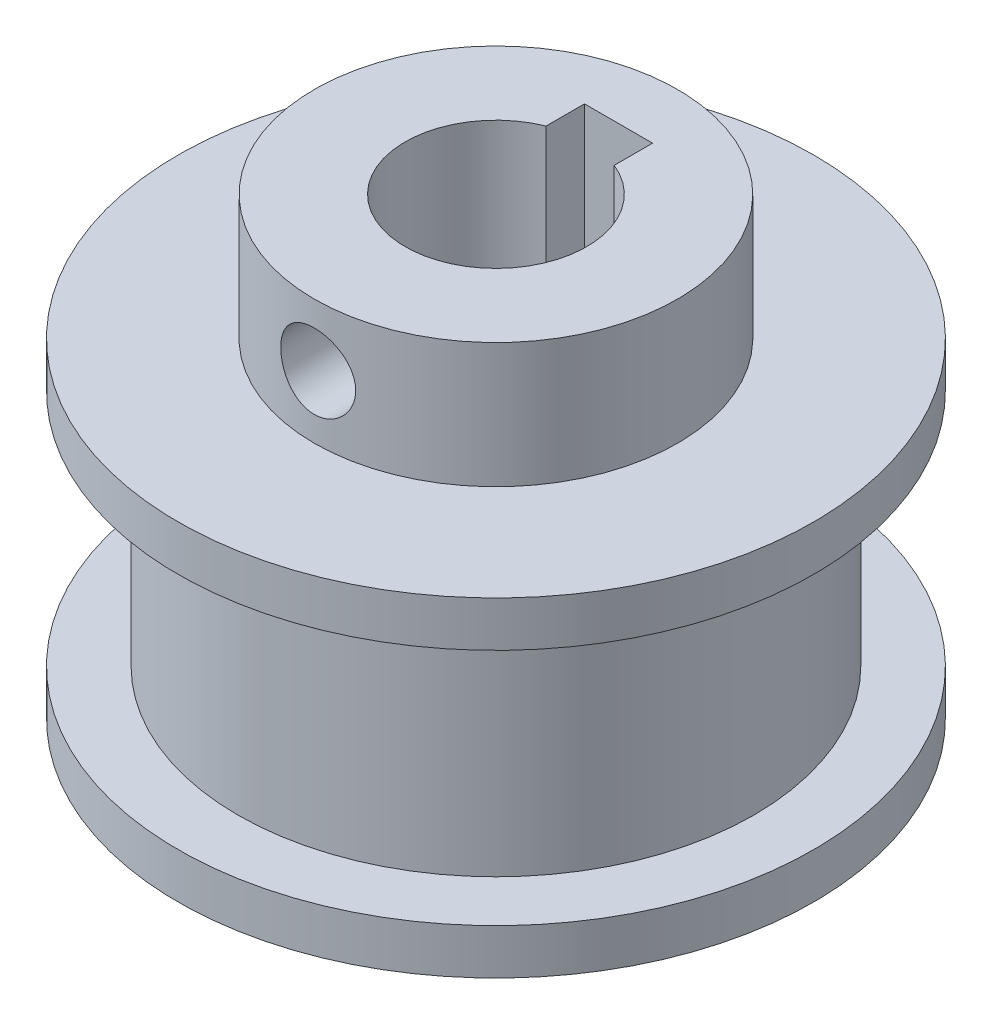
ISO-10303-21;
HEADER;
FILE_DESCRIPTION(('STEP AP214'),'2;1');
FILE_NAME('part.step','',(''),(''),'','','');
FILE_SCHEMA(('AUTOMOTIVE_DESIGN { 1 0 10303 214 1 1 1 1 }'));
ENDSEC;
DATA;
#1=APPLICATION_CONTEXT('core data for automotive mechanical design processes');
#2=APPLICATION_PROTOCOL_DEFINITION('international standard','automotive_design',2000,#1);
#3=PRODUCT_CONTEXT('',#1,'mechanical');
#4=PRODUCT('Part','Part','',(#3));
#5=PRODUCT_RELATED_PRODUCT_CATEGORY('part','',(#4));
#6=PRODUCT_DEFINITION_FORMATION('','',#4);
#7=PRODUCT_DEFINITION_CONTEXT('part definition',#1,'design');
#8=PRODUCT_DEFINITION('design','',#6,#7);
#9=PRODUCT_DEFINITION_SHAPE('','',#8);
#10=(LENGTH_UNIT() NAMED_UNIT(*) SI_UNIT(.MILLI.,.METRE.));
#11=(NAMED_UNIT(*) PLANE_ANGLE_UNIT() SI_UNIT($,.RADIAN.));
#12=(NAMED_UNIT(*) SI_UNIT($,.STERADIAN.) SOLID_ANGLE_UNIT());
#13=UNCERTAINTY_MEASURE_WITH_UNIT(LENGTH_MEASURE(1.E-05),#10,'distance_accuracy_value','');
#14=(GEOMETRIC_REPRESENTATION_CONTEXT(3) GLOBAL_UNCERTAINTY_ASSIGNED_CONTEXT((#13)) GLOBAL_UNIT_ASSIGNED_CONTEXT((#10,
#11,#12)) REPRESENTATION_CONTEXT('',''));
#15=CARTESIAN_POINT('',(0.,0.,0.));
#16=DIRECTION('',(0.,0.,1.));
#17=DIRECTION('',(1.,0.,0.));
#18=AXIS2_PLACEMENT_3D('',#15,#16,#17);
#19=CARTESIAN_POINT('',(0.,14.5,0.));
#20=DIRECTION('',(0.,-1.,0.));
#21=DIRECTION('',(0.,0.,-1.));
#22=AXIS2_PLACEMENT_3D('',#19,#20,#21);
#23=CYLINDRICAL_SURFACE('',#22,14.);
#24=CARTESIAN_POINT('',(0.,12.5,0.));
#25=DIRECTION('',(0.,1.,0.));
#26=DIRECTION('',(0.,0.,1.));
#27=AXIS2_PLACEMENT_3D('',#24,#25,#26);
#28=CIRCLE('',#27,14.);
#29=CARTESIAN_POINT('',(0.,12.5,-14.));
#30=VERTEX_POINT('',#29);
#31=EDGE_CURVE('E141',#30,#30,#28,.T.);
#32=CARTESIAN_POINT('',(0.,14.5,0.));
#33=DIRECTION('',(0.,1.,0.));
#34=DIRECTION('',(0.,0.,1.));
#35=AXIS2_PLACEMENT_3D('',#32,#33,#34);
#36=CIRCLE('',#35,14.);
#37=CARTESIAN_POINT('',(0.,14.5,-14.));
#38=VERTEX_POINT('',#37);
#39=EDGE_CURVE('E142',#38,#38,#36,.T.);
#40=CARTESIAN_POINT('',(0.,12.5,-14.));
#41=CARTESIAN_POINT('',(0.,12.5208333333333,-14.));
#42=CARTESIAN_POINT('',(0.,12.5416666666667,-14.));
#43=CARTESIAN_POINT('',(0.,12.5833333333333,-14.));
#44=CARTESIAN_POINT('',(0.,12.6041666666667,-14.));
#45=CARTESIAN_POINT('',(0.,12.6458333333333,-14.));
#46=CARTESIAN_POINT('',(0.,12.6666666666667,-14.));
#47=CARTESIAN_POINT('',(0.,12.7083333333333,-14.));
#48=CARTESIAN_POINT('',(0.,12.7291666666667,-14.));
#49=CARTESIAN_POINT('',(0.,12.7708333333333,-14.));
#50=CARTESIAN_POINT('',(0.,12.7916666666667,-14.));
#51=CARTESIAN_POINT('',(0.,12.8333333333333,-14.));
#52=CARTESIAN_POINT('',(0.,12.8541666666667,-14.));
#53=CARTESIAN_POINT('',(0.,12.8958333333333,-14.));
#54=CARTESIAN_POINT('',(0.,12.9166666666667,-14.));
#55=CARTESIAN_POINT('',(0.,12.9583333333333,-14.));
#56=CARTESIAN_POINT('',(0.,12.9791666666667,-14.));
#57=CARTESIAN_POINT('',(0.,13.0208333333333,-14.));
#58=CARTESIAN_POINT('',(0.,13.0416666666667,-14.));
#59=CARTESIAN_POINT('',(0.,13.0833333333333,-14.));
#60=CARTESIAN_POINT('',(0.,13.1041666666667,-14.));
#61=CARTESIAN_POINT('',(0.,13.1458333333333,-14.));
#62=CARTESIAN_POINT('',(0.,13.1666666666667,-14.));
#63=CARTESIAN_POINT('',(0.,13.2083333333333,-14.));
#64=CARTESIAN_POINT('',(0.,13.2291666666667,-14.));
#65=CARTESIAN_POINT('',(0.,13.2708333333333,-14.));
#66=CARTESIAN_POINT('',(0.,13.2916666666667,-14.));
#67=CARTESIAN_POINT('',(0.,13.3333333333333,-14.));
#68=CARTESIAN_POINT('',(0.,13.3541666666667,-14.));
#69=CARTESIAN_POINT('',(0.,13.3958333333333,-14.));
#70=CARTESIAN_POINT('',(0.,13.4166666666667,-14.));
#71=CARTESIAN_POINT('',(0.,13.4583333333333,-14.));
#72=CARTESIAN_POINT('',(0.,13.4791666666667,-14.));
#73=CARTESIAN_POINT('',(0.,13.5208333333333,-14.));
#74=CARTESIAN_POINT('',(0.,13.5416666666667,-14.));
#75=CARTESIAN_POINT('',(0.,13.5833333333333,-14.));
#76=CARTESIAN_POINT('',(0.,13.6041666666667,-14.));
#77=CARTESIAN_POINT('',(0.,13.6458333333333,-14.));
#78=CARTESIAN_POINT('',(0.,13.6666666666667,-14.));
#79=CARTESIAN_POINT('',(0.,13.7083333333333,-14.));
#80=CARTESIAN_POINT('',(0.,13.7291666666667,-14.));
#81=CARTESIAN_POINT('',(0.,13.7708333333333,-14.));
#82=CARTESIAN_POINT('',(0.,13.7916666666667,-14.));
#83=CARTESIAN_POINT('',(0.,13.8333333333333,-14.));
#84=CARTESIAN_POINT('',(0.,13.8541666666667,-14.));
#85=CARTESIAN_POINT('',(0.,13.8958333333333,-14.));
#86=CARTESIAN_POINT('',(0.,13.9166666666667,-14.));
#87=CARTESIAN_POINT('',(0.,13.9583333333333,-14.));
#88=CARTESIAN_POINT('',(0.,13.9791666666667,-14.));
#89=CARTESIAN_POINT('',(0.,14.0208333333333,-14.));
#90=CARTESIAN_POINT('',(0.,14.0416666666667,-14.));
#91=CARTESIAN_POINT('',(0.,14.0833333333333,-14.));
#92=CARTESIAN_POINT('',(0.,14.1041666666667,-14.));
#93=CARTESIAN_POINT('',(0.,14.1458333333333,-14.));
#94=CARTESIAN_POINT('',(0.,14.1666666666667,-14.));
#95=CARTESIAN_POINT('',(0.,14.2083333333333,-14.));
#96=CARTESIAN_POINT('',(0.,14.2291666666667,-14.));
#97=CARTESIAN_POINT('',(0.,14.2708333333333,-14.));
#98=CARTESIAN_POINT('',(0.,14.2916666666667,-14.));
#99=CARTESIAN_POINT('',(0.,14.3333333333333,-14.));
#100=CARTESIAN_POINT('',(0.,14.3541666666667,-14.));
#101=CARTESIAN_POINT('',(0.,14.3958333333333,-14.));
#102=CARTESIAN_POINT('',(0.,14.4166666666667,-14.));
#103=CARTESIAN_POINT('',(0.,14.4583333333333,-14.));
#104=CARTESIAN_POINT('',(0.,14.4791666666667,-14.));
#105=CARTESIAN_POINT('',(0.,14.5,-14.));
#106=B_SPLINE_CURVE_WITH_KNOTS('',3,(#40,#41,#42,#43,#44,#45,#46,#47,#48,#49,#50,#51,#52,#53,
#54,#55,#56,#57,#58,#59,#60,#61,#62,#63,#64,#65,#66,#67,#68,#69,#70,#71,#72,#73,#74,#75,#76,#77,
#78,#79,#80,#81,#82,#83,#84,#85,#86,#87,#88,#89,#90,#91,#92,#93,#94,#95,#96,#97,#98,#99,#100,
#101,#102,#103,#104,#105),.UNSPECIFIED.,.F.,.F.,(4,2,2,2,2,2,2,2,2,2,2,2,2,2,2,2,2,2,2,2,2,2,2,
2,2,2,2,2,2,2,2,2,4),(0.,0.0625000000000001,0.124999999999998,0.187499999999998,
0.249999999999999,0.312499999999999,0.374999999999999,0.437499999999999,0.499999999999999,
0.562499999999999,0.624999999999999,0.687499999999999,0.749999999999999,0.812499999999999,
0.874999999999999,0.937499999999999,0.999999999999999,1.0625,1.125,1.1875,1.25,1.3125,1.375,
1.4375,1.5,1.5625,1.625,1.6875,1.75,1.8125,1.875,1.9375,2.),.UNSPECIFIED.);
#107=EDGE_CURVE('BSEAM41',#30,#38,#106,.T.);
#108=ORIENTED_EDGE('',*,*,#31,.T.);
#109=ORIENTED_EDGE('',*,*,#39,.F.);
#110=ORIENTED_EDGE('',*,*,#107,.T.);
#111=ORIENTED_EDGE('',*,*,#107,.F.);
#112=EDGE_LOOP('',(#108,#110,#109,#111));
#113=FACE_BOUND('',#112,.T.);
#114=ADVANCED_FACE('F41',(#113),#23,.T.);
#115=CARTESIAN_POINT('',(0.,14.5,0.));
#116=DIRECTION('',(0.,1.,0.));
#117=DIRECTION('',(0.,0.,1.));
#118=AXIS2_PLACEMENT_3D('',#115,#116,#117);
#119=PLANE('',#118);
#120=ORIENTED_EDGE('',*,*,#39,.T.);
#121=EDGE_LOOP('',(#120));
#122=FACE_BOUND('',#121,.T.);
#123=CARTESIAN_POINT('',(0.,14.5,0.));
#124=DIRECTION('',(0.,1.,0.));
#125=DIRECTION('',(0.,0.,1.));
#126=AXIS2_PLACEMENT_3D('',#123,#124,#125);
#127=CIRCLE('',#126,8.);
#128=CARTESIAN_POINT('',(0.,14.5,8.));
#129=VERTEX_POINT('',#128);
#130=EDGE_CURVE('E138',#129,#129,#127,.T.);
#131=ORIENTED_EDGE('',*,*,#130,.F.);
#132=EDGE_LOOP('',(#131));
#133=FACE_BOUND('',#132,.T.);
#134=ADVANCED_FACE('F165',(#122,#133),#119,.T.);
#135=CARTESIAN_POINT('',(0.,20.,0.));
#136=DIRECTION('',(0.,-1.,0.));
#137=DIRECTION('',(0.,0.,-1.));
#138=AXIS2_PLACEMENT_3D('',#135,#136,#137);
#139=CYLINDRICAL_SURFACE('',#138,8.);
#140=CARTESIAN_POINT('',(1.65,17.25,7.82799463464303));
#141=CARTESIAN_POINT('',(1.64999668532493,17.1583826502059,7.82799647234761));
#142=CARTESIAN_POINT('',(1.64234339972764,17.0667241852472,7.82962054015776));
#143=CARTESIAN_POINT('',(1.61196056082936,16.8860046309142,7.83593102109728));
#144=CARTESIAN_POINT('',(1.58921932254548,16.7969456105535,7.84061980768031));
#145=CARTESIAN_POINT('',(1.52939944297714,16.6240655077954,7.85250661788931));
#146=CARTESIAN_POINT('',(1.49233553761892,16.5402391443872,7.85970206178507));
#147=CARTESIAN_POINT('',(1.40496339378157,16.3799953977351,7.8757883628587));
#148=CARTESIAN_POINT('',(1.35465574212316,16.3035776864245,7.88467914491256));
#149=CARTESIAN_POINT('',(1.24141806188276,16.1591686968544,7.90330366333984));
#150=CARTESIAN_POINT('',(1.17832691131059,16.0913049987195,7.91304715328143));
#151=CARTESIAN_POINT('',(1.04166118718968,15.9670453862397,7.93219354684102));
#152=CARTESIAN_POINT('',(0.968085854144703,15.9106503034243,7.9415964257225));
#153=CARTESIAN_POINT('',(0.811692001393456,15.8104305736417,7.95910768239297));
#154=CARTESIAN_POINT('',(0.728793920101066,15.7667276461819,7.9672032148807));
#155=CARTESIAN_POINT('',(0.556636173632881,15.6939188905658,7.98107786735649));
#156=CARTESIAN_POINT('',(0.467377143134518,15.6648116084199,7.9868572180665));
#157=CARTESIAN_POINT('',(0.286356118265321,15.622418887495,7.99537941797959));
#158=CARTESIAN_POINT('',(0.19464659352139,15.6089178479032,7.99816360714569));
#159=CARTESIAN_POINT('',(0.0102247919218258,15.5974477285783,8.00052470522147));
#160=CARTESIAN_POINT('',(-0.082487381468869,15.5994770612279,8.00010194196704));
#161=CARTESIAN_POINT('',(-0.264799667160886,15.6188475119041,7.9961286601365));
#162=CARTESIAN_POINT('',(-0.354425644609062,15.6359563448791,7.99262559257093));
#163=CARTESIAN_POINT('',(-0.529506535845927,15.6846311464242,7.98293899531616));
#164=CARTESIAN_POINT('',(-0.614961275239553,15.7161977188853,7.97675535366161));
#165=CARTESIAN_POINT('',(-0.779930808135336,15.7931039596909,7.96232481023258));
#166=CARTESIAN_POINT('',(-0.859402403191202,15.838533669891,7.95406448397429));
#167=CARTESIAN_POINT('',(-1.00967984091355,15.9418098140578,7.93638961806161));
#168=CARTESIAN_POINT('',(-1.0804846248177,15.9996577626995,7.92697493766869));
#169=CARTESIAN_POINT('',(-1.21279807501825,16.1273994926951,7.9078239642189));
#170=CARTESIAN_POINT('',(-1.27411022634264,16.1974965760101,7.89808494418976));
#171=CARTESIAN_POINT('',(-1.38414252261934,16.3470770452591,7.87954771497238));
#172=CARTESIAN_POINT('',(-1.43286239817598,16.4265606319523,7.87074952591436));
#173=CARTESIAN_POINT('',(-1.51640121308694,16.592951545323,7.85508413098618));
#174=CARTESIAN_POINT('',(-1.55118662114807,16.6798761755531,7.84822159457677));
#175=CARTESIAN_POINT('',(-1.60559987539904,16.8585111082259,7.83727167258975));
#176=CARTESIAN_POINT('',(-1.62522983445703,16.9502207416726,7.83318390018328));
#177=CARTESIAN_POINT('',(-1.64847767759948,17.1340365645272,7.82832430034404));
#178=CARTESIAN_POINT('',(-1.65238010858406,17.2261052491494,7.82749355348184));
#179=CARTESIAN_POINT('',(-1.64482933127386,17.409577873694,7.8290836566982));
#180=CARTESIAN_POINT('',(-1.63337705280605,17.5009818535317,7.83150430988348));
#181=CARTESIAN_POINT('',(-1.59568777426686,17.6795629257063,7.83926913983493));
#182=CARTESIAN_POINT('',(-1.56960432546509,17.7667738663095,7.84458293687796));
#183=CARTESIAN_POINT('',(-1.50355797289372,17.9355877632628,7.85750843647708));
#184=CARTESIAN_POINT('',(-1.46359386451765,18.0171902321559,7.8651203384623));
#185=CARTESIAN_POINT('',(-1.37028211396986,18.1737114518423,7.88191579950281));
#186=CARTESIAN_POINT('',(-1.31675731908659,18.2485223754957,7.89111960565472));
#187=CARTESIAN_POINT('',(-1.19807829347333,18.3882045238013,7.91000699478186));
#188=CARTESIAN_POINT('',(-1.1329227860428,18.453074655801,7.91969063034348));
#189=CARTESIAN_POINT('',(-0.991551131023632,18.5721209376943,7.93863877717957));
#190=CARTESIAN_POINT('',(-0.915171051258589,18.6261041698581,7.94789380519354));
#191=CARTESIAN_POINT('',(-0.754260738130267,18.7204722827775,7.96477402593325));
#192=CARTESIAN_POINT('',(-0.669730860728579,18.7608577571013,7.97239928979603));
#193=CARTESIAN_POINT('',(-0.495414150876533,18.8266068059184,7.98512048804082));
#194=CARTESIAN_POINT('',(-0.405661891513268,18.852059030768,7.99023131933467));
#195=CARTESIAN_POINT('',(-0.223039444294584,18.8874987524781,7.99741186635557));
#196=CARTESIAN_POINT('',(-0.13016965858092,18.8974882361651,7.99948197278732));
#197=CARTESIAN_POINT('',(0.0542126492055752,18.9016379277564,8.00033781964049));
#198=CARTESIAN_POINT('',(0.1457185021403,18.8960875124828,7.99918360281958));
#199=CARTESIAN_POINT('',(0.326463478938169,18.8699566049096,7.99384751004402));
#200=CARTESIAN_POINT('',(0.415702635080899,18.8493763267716,7.98966567723011));
#201=CARTESIAN_POINT('',(0.589186560182798,18.7939018588418,7.97874682116246));
#202=CARTESIAN_POINT('',(0.673443542985808,18.759044489013,7.97201637401338));
#203=CARTESIAN_POINT('',(0.834953513276953,18.6760429578936,7.95672300876336));
#204=CARTESIAN_POINT('',(0.912205904261781,18.6278976664275,7.9481599348062));
#205=CARTESIAN_POINT('',(1.05893847166514,18.5187213547144,7.92995681960445));
#206=CARTESIAN_POINT('',(1.12826349060999,18.45748443025,7.92030089151862));
#207=CARTESIAN_POINT('',(1.25575285452553,18.3242837583535,7.90109178015231));
#208=CARTESIAN_POINT('',(1.31391453937944,18.2523174614546,7.89153862187156));
#209=CARTESIAN_POINT('',(1.41807001635074,18.0986988961721,7.87349423401939));
#210=CARTESIAN_POINT('',(1.46391490783104,18.0169439976916,7.86501660134749));
#211=CARTESIAN_POINT('',(1.54114313624576,17.8467371138309,7.85025069483304));
#212=CARTESIAN_POINT('',(1.5725393093673,17.7582911544332,7.84396047891661));
#213=CARTESIAN_POINT('',(1.61404620798978,17.5997327756977,7.83550744278865));
#214=CARTESIAN_POINT('',(1.62750420424828,17.530511051599,7.83270799535493));
#215=CARTESIAN_POINT('',(1.64548220150439,17.3908676234553,7.82895092043294));
#216=CARTESIAN_POINT('',(1.65000254870379,17.3204459659967,7.82799322160417));
#217=CARTESIAN_POINT('',(1.65,17.25,7.82799463464303));
#218=B_SPLINE_CURVE_WITH_KNOTS('',3,(#140,#141,#142,#143,#144,#145,#146,#147,#148,#149,#150,
#151,#152,#153,#154,#155,#156,#157,#158,#159,#160,#161,#162,#163,#164,#165,#166,#167,#168,#169,
#170,#171,#172,#173,#174,#175,#176,#177,#178,#179,#180,#181,#182,#183,#184,#185,#186,#187,#188,
#189,#190,#191,#192,#193,#194,#195,#196,#197,#198,#199,#200,#201,#202,#203,#204,#205,#206,#207,
#208,#209,#210,#211,#212,#213,#214,#215,#216,#217),.UNSPECIFIED.,.T.,.F.,(4,2,2,2,2,2,2,2,2,2,2,
2,2,2,2,2,2,2,2,2,2,2,2,2,2,2,2,2,2,2,2,2,2,2,2,2,2,2,4),(0.,0.274594036981752,
0.549400984088788,0.823925944657623,1.09843874327276,1.3766547467594,1.65489091505465,
1.93571338943598,2.21650788327397,2.49337499570618,2.7702138053317,3.04286128513494,
3.31552015429504,3.58998907522696,3.86449149267073,4.14407920367274,4.42367289560191,
4.70393540521659,4.98415883550652,5.25928898855095,5.53440248143718,5.80668132243983,
6.0789837985472,6.35504561674321,6.63113775683412,6.91175972338567,7.19236943866023,
7.47129602001297,7.75018675877318,8.02391884651825,8.29764703391016,8.57067368982023,
8.84372357458462,9.12143378060414,9.39921008040031,9.68020708192083,9.96095396255222,
10.1721016499173,10.38324115827),.UNSPECIFIED.);
#219=CARTESIAN_POINT('',(1.65,17.25,7.82799463464303));
#220=VERTEX_POINT('',#219);
#221=EDGE_CURVE('E11',#220,#220,#218,.T.);
#222=ORIENTED_EDGE('',*,*,#221,.T.);
#223=EDGE_LOOP('',(#222));
#224=FACE_BOUND('',#223,.T.);
#225=CARTESIAN_POINT('',(0.,20.,0.));
#226=DIRECTION('',(0.,1.,0.));
#227=DIRECTION('',(0.,0.,1.));
#228=AXIS2_PLACEMENT_3D('',#225,#226,#227);
#229=CIRCLE('',#228,8.);
#230=CARTESIAN_POINT('',(0.,20.,8.));
#231=VERTEX_POINT('',#230);
#232=EDGE_CURVE('E134',#231,#231,#229,.T.);
#233=ORIENTED_EDGE('',*,*,#232,.F.);
#234=EDGE_LOOP('',(#233));
#235=FACE_BOUND('',#234,.T.);
#236=ORIENTED_EDGE('',*,*,#130,.T.);
#237=EDGE_LOOP('',(#236));
#238=FACE_BOUND('',#237,.T.);
#239=ADVANCED_FACE('F159',(#224,#235,#238),#139,.T.);
#240=CARTESIAN_POINT('',(0.,20.,0.));
#241=DIRECTION('',(0.,1.,0.));
#242=DIRECTION('',(0.,0.,1.));
#243=AXIS2_PLACEMENT_3D('',#240,#241,#242);
#244=PLANE('',#243);
#245=DIRECTION('',(0.,0.,-1.));
#246=VECTOR('',#245,1.);
#247=CARTESIAN_POINT('',(1.5,20.,-5.4));
#248=LINE('',#247,#246);
#249=CARTESIAN_POINT('',(1.5,20.,-3.70809924354783));
#250=VERTEX_POINT('',#249);
#251=CARTESIAN_POINT('',(1.5,20.,-5.4));
#252=VERTEX_POINT('',#251);
#253=EDGE_CURVE('E92',#250,#252,#248,.T.);
#254=ORIENTED_EDGE('',*,*,#253,.F.);
#255=CARTESIAN_POINT('',(0.,20.,0.));
#256=DIRECTION('',(0.,1.,0.));
#257=DIRECTION('',(0.,0.,1.));
#258=AXIS2_PLACEMENT_3D('',#255,#256,#257);
#259=CIRCLE('',#258,4.);
#260=CARTESIAN_POINT('',(-1.5,20.,-3.70809924354783));
#261=VERTEX_POINT('',#260);
#262=EDGE_CURVE('E122',#261,#250,#259,.T.);
#263=ORIENTED_EDGE('',*,*,#262,.F.);
#264=DIRECTION('',(0.,0.,1.));
#265=VECTOR('',#264,1.);
#266=CARTESIAN_POINT('',(-1.5,20.,-5.4));
#267=LINE('',#266,#265);
#268=CARTESIAN_POINT('',(-1.5,20.,-5.4));
#269=VERTEX_POINT('',#268);
#270=EDGE_CURVE('E61',#269,#261,#267,.T.);
#271=ORIENTED_EDGE('',*,*,#270,.F.);
#272=DIRECTION('',(-1.,0.,0.));
#273=VECTOR('',#272,1.);
#274=CARTESIAN_POINT('',(-1.5,20.,-5.4));
#275=LINE('',#274,#273);
#276=EDGE_CURVE('E110',#252,#269,#275,.T.);
#277=ORIENTED_EDGE('',*,*,#276,.F.);
#278=EDGE_LOOP('',(#254,#263,#271,#277));
#279=FACE_BOUND('',#278,.T.);
#280=ORIENTED_EDGE('',*,*,#232,.T.);
#281=EDGE_LOOP('',(#280));
#282=FACE_BOUND('',#281,.T.);
#283=ADVANCED_FACE('F155',(#279,#282),#244,.T.);
#284=CARTESIAN_POINT('',(0.,12.5,16.635));
#285=DIRECTION('',(0.,1.,0.));
#286=DIRECTION('',(0.,0.,1.));
#287=AXIS2_PLACEMENT_3D('',#284,#285,#286);
#288=PLANE('',#287);
#289=CARTESIAN_POINT('',(0.,12.5,0.));
#290=DIRECTION('',(0.,1.,0.));
#291=DIRECTION('',(0.,0.,1.));
#292=AXIS2_PLACEMENT_3D('',#289,#290,#291);
#293=CIRCLE('',#292,11.365);
#294=CARTESIAN_POINT('',(0.,12.5,11.365));
#295=VERTEX_POINT('',#294);
#296=EDGE_CURVE('E130',#295,#295,#293,.T.);
#297=ORIENTED_EDGE('',*,*,#296,.T.);
#298=EDGE_LOOP('',(#297));
#299=FACE_BOUND('',#298,.T.);
#300=ORIENTED_EDGE('',*,*,#31,.F.);
#301=EDGE_LOOP('',(#300));
#302=FACE_BOUND('',#301,.T.);
#303=ADVANCED_FACE('F158',(#299,#302),#288,.F.);
#304=CARTESIAN_POINT('',(0.,2.,16.635));
#305=DIRECTION('',(0.,-1.,0.));
#306=DIRECTION('',(0.,0.,-1.));
#307=AXIS2_PLACEMENT_3D('',#304,#305,#306);
#308=PLANE('',#307);
#309=CARTESIAN_POINT('',(0.,2.,0.));
#310=DIRECTION('',(0.,1.,0.));
#311=DIRECTION('',(0.,0.,1.));
#312=AXIS2_PLACEMENT_3D('',#309,#310,#311);
#313=CIRCLE('',#312,11.365);
#314=CARTESIAN_POINT('',(0.,2.,11.365));
#315=VERTEX_POINT('',#314);
#316=EDGE_CURVE('E125',#315,#315,#313,.T.);
#317=ORIENTED_EDGE('',*,*,#316,.F.);
#318=EDGE_LOOP('',(#317));
#319=FACE_BOUND('',#318,.T.);
#320=CARTESIAN_POINT('',(0.,2.,0.));
#321=DIRECTION('',(0.,-1.,0.));
#322=DIRECTION('',(0.,0.,-1.));
#323=AXIS2_PLACEMENT_3D('',#320,#321,#322);
#324=CIRCLE('',#323,14.);
#325=CARTESIAN_POINT('',(0.,2.00000000000001,-14.));
#326=VERTEX_POINT('',#325);
#327=EDGE_CURVE('E133',#326,#326,#324,.T.);
#328=ORIENTED_EDGE('',*,*,#327,.F.);
#329=EDGE_LOOP('',(#328));
#330=FACE_BOUND('',#329,.T.);
#331=ADVANCED_FACE('F185',(#319,#330),#308,.F.);
#332=CARTESIAN_POINT('',(0.,14.5,0.));
#333=DIRECTION('',(0.,1.,0.));
#334=DIRECTION('',(0.,0.,1.));
#335=AXIS2_PLACEMENT_3D('',#332,#333,#334);
#336=CYLINDRICAL_SURFACE('',#335,11.365);
#337=ORIENTED_EDGE('',*,*,#296,.F.);
#338=EDGE_LOOP('',(#337));
#339=FACE_BOUND('',#338,.T.);
#340=ORIENTED_EDGE('',*,*,#316,.T.);
#341=EDGE_LOOP('',(#340));
#342=FACE_BOUND('',#341,.T.);
#343=ADVANCED_FACE('F178',(#339,#342),#336,.T.);
#344=CARTESIAN_POINT('',(0.,0.,0.));
#345=DIRECTION('',(0.,1.,0.));
#346=DIRECTION('',(0.,0.,1.));
#347=AXIS2_PLACEMENT_3D('',#344,#345,#346);
#348=PLANE('',#347);
#349=CARTESIAN_POINT('',(0.,0.,0.));
#350=DIRECTION('',(0.,1.,0.));
#351=DIRECTION('',(0.,0.,1.));
#352=AXIS2_PLACEMENT_3D('',#349,#350,#351);
#353=CIRCLE('',#352,4.);
#354=CARTESIAN_POINT('',(-1.5,0.,-3.70809924354783));
#355=VERTEX_POINT('',#354);
#356=CARTESIAN_POINT('',(1.5,0.,-3.70809924354783));
#357=VERTEX_POINT('',#356);
#358=EDGE_CURVE('E108',#355,#357,#353,.T.);
#359=ORIENTED_EDGE('',*,*,#358,.T.);
#360=DIRECTION('',(0.,0.,-1.));
#361=VECTOR('',#360,1.);
#362=CARTESIAN_POINT('',(1.5,0.,-5.4));
#363=LINE('',#362,#361);
#364=CARTESIAN_POINT('',(1.5,0.,-5.4));
#365=VERTEX_POINT('',#364);
#366=EDGE_CURVE('E89',#357,#365,#363,.T.);
#367=ORIENTED_EDGE('',*,*,#366,.T.);
#368=DIRECTION('',(-1.,0.,0.));
#369=VECTOR('',#368,1.);
#370=CARTESIAN_POINT('',(-1.5,0.,-5.4));
#371=LINE('',#370,#369);
#372=CARTESIAN_POINT('',(-1.5,0.,-5.4));
#373=VERTEX_POINT('',#372);
#374=EDGE_CURVE('E100',#365,#373,#371,.T.);
#375=ORIENTED_EDGE('',*,*,#374,.T.);
#376=DIRECTION('',(0.,0.,1.));
#377=VECTOR('',#376,1.);
#378=CARTESIAN_POINT('',(-1.5,0.,-5.4));
#379=LINE('',#378,#377);
#380=EDGE_CURVE('E97',#373,#355,#379,.T.);
#381=ORIENTED_EDGE('',*,*,#380,.T.);
#382=EDGE_LOOP('',(#359,#367,#375,#381));
#383=FACE_BOUND('',#382,.T.);
#384=CARTESIAN_POINT('',(0.,0.,0.));
#385=DIRECTION('',(0.,1.,0.));
#386=DIRECTION('',(0.,0.,1.));
#387=AXIS2_PLACEMENT_3D('',#384,#385,#386);
#388=CIRCLE('',#387,14.);
#389=CARTESIAN_POINT('',(0.,0.,-14.));
#390=VERTEX_POINT('',#389);
#391=EDGE_CURVE('E137',#390,#390,#388,.T.);
#392=ORIENTED_EDGE('',*,*,#391,.F.);
#393=EDGE_LOOP('',(#392));
#394=FACE_BOUND('',#393,.T.);
#395=ADVANCED_FACE('F105',(#383,#394),#348,.F.);
#396=CARTESIAN_POINT('',(0.,2.00000000000001,-14.));
#397=CARTESIAN_POINT('',(0.,1.97916666666667,-14.));
#398=CARTESIAN_POINT('',(0.,1.95833333333334,-14.));
#399=CARTESIAN_POINT('',(0.,1.91666666666667,-14.));
#400=CARTESIAN_POINT('',(0.,1.89583333333334,-14.));
#401=CARTESIAN_POINT('',(0.,1.85416666666667,-14.));
#402=CARTESIAN_POINT('',(0.,1.83333333333334,-14.));
#403=CARTESIAN_POINT('',(0.,1.79166666666667,-14.));
#404=CARTESIAN_POINT('',(0.,1.77083333333334,-14.));
#405=CARTESIAN_POINT('',(0.,1.72916666666667,-14.));
#406=CARTESIAN_POINT('',(0.,1.70833333333334,-14.));
#407=CARTESIAN_POINT('',(0.,1.66666666666667,-14.));
#408=CARTESIAN_POINT('',(0.,1.64583333333334,-14.));
#409=CARTESIAN_POINT('',(0.,1.60416666666667,-14.));
#410=CARTESIAN_POINT('',(0.,1.58333333333334,-14.));
#411=CARTESIAN_POINT('',(0.,1.54166666666667,-14.));
#412=CARTESIAN_POINT('',(0.,1.52083333333334,-14.));
#413=CARTESIAN_POINT('',(0.,1.47916666666667,-14.));
#414=CARTESIAN_POINT('',(0.,1.45833333333334,-14.));
#415=CARTESIAN_POINT('',(0.,1.41666666666667,-14.));
#416=CARTESIAN_POINT('',(0.,1.39583333333334,-14.));
#417=CARTESIAN_POINT('',(0.,1.35416666666667,-14.));
#418=CARTESIAN_POINT('',(0.,1.33333333333334,-14.));
#419=CARTESIAN_POINT('',(0.,1.29166666666667,-14.));
#420=CARTESIAN_POINT('',(0.,1.27083333333334,-14.));
#421=CARTESIAN_POINT('',(0.,1.22916666666667,-14.));
#422=CARTESIAN_POINT('',(0.,1.20833333333334,-14.));
#423=CARTESIAN_POINT('',(0.,1.16666666666667,-14.));
#424=CARTESIAN_POINT('',(0.,1.14583333333334,-14.));
#425=CARTESIAN_POINT('',(0.,1.10416666666667,-14.));
#426=CARTESIAN_POINT('',(0.,1.08333333333334,-14.));
#427=CARTESIAN_POINT('',(0.,1.04166666666667,-14.));
#428=CARTESIAN_POINT('',(0.,1.02083333333334,-14.));
#429=CARTESIAN_POINT('',(0.,0.979166666666669,-14.));
#430=CARTESIAN_POINT('',(0.,0.958333333333336,-14.));
#431=CARTESIAN_POINT('',(0.,0.916666666666669,-14.));
#432=CARTESIAN_POINT('',(0.,0.895833333333336,-14.));
#433=CARTESIAN_POINT('',(0.,0.854166666666669,-14.));
#434=CARTESIAN_POINT('',(0.,0.833333333333336,-14.));
#435=CARTESIAN_POINT('',(0.,0.791666666666669,-14.));
#436=CARTESIAN_POINT('',(0.,0.770833333333336,-14.));
#437=CARTESIAN_POINT('',(0.,0.729166666666669,-14.));
#438=CARTESIAN_POINT('',(0.,0.708333333333336,-14.));
#439=CARTESIAN_POINT('',(0.,0.666666666666669,-14.));
#440=CARTESIAN_POINT('',(0.,0.645833333333336,-14.));
#441=CARTESIAN_POINT('',(0.,0.604166666666668,-14.));
#442=CARTESIAN_POINT('',(0.,0.583333333333334,-14.));
#443=CARTESIAN_POINT('',(0.,0.541666666666667,-14.));
#444=CARTESIAN_POINT('',(0.,0.520833333333334,-14.));
#445=CARTESIAN_POINT('',(0.,0.479166666666667,-14.));
#446=CARTESIAN_POINT('',(0.,0.458333333333334,-14.));
#447=CARTESIAN_POINT('',(0.,0.416666666666667,-14.));
#448=CARTESIAN_POINT('',(0.,0.395833333333334,-14.));
#449=CARTESIAN_POINT('',(0.,0.354166666666667,-14.));
#450=CARTESIAN_POINT('',(0.,0.333333333333334,-14.));
#451=CARTESIAN_POINT('',(0.,0.291666666666667,-14.));
#452=CARTESIAN_POINT('',(0.,0.270833333333334,-14.));
#453=CARTESIAN_POINT('',(0.,0.229166666666667,-14.));
#454=CARTESIAN_POINT('',(0.,0.208333333333334,-14.));
#455=CARTESIAN_POINT('',(0.,0.166666666666667,-14.));
#456=CARTESIAN_POINT('',(0.,0.145833333333333,-14.));
#457=CARTESIAN_POINT('',(0.,0.104166666666667,-14.));
#458=CARTESIAN_POINT('',(0.,0.0833333333333334,-14.));
#459=CARTESIAN_POINT('',(0.,0.0416666666666667,-14.));
#460=CARTESIAN_POINT('',(0.,0.0208333333333333,-14.));
#461=CARTESIAN_POINT('',(0.,0.,-14.));
#462=B_SPLINE_CURVE_WITH_KNOTS('',3,(#396,#397,#398,#399,#400,#401,#402,#403,#404,#405,#406,
#407,#408,#409,#410,#411,#412,#413,#414,#415,#416,#417,#418,#419,#420,#421,#422,#423,#424,#425,
#426,#427,#428,#429,#430,#431,#432,#433,#434,#435,#436,#437,#438,#439,#440,#441,#442,#443,#444,
#445,#446,#447,#448,#449,#450,#451,#452,#453,#454,#455,#456,#457,#458,#459,#460,#461),
.UNSPECIFIED.,.F.,.F.,(4,2,2,2,2,2,2,2,2,2,2,2,2,2,2,2,2,2,2,2,2,2,2,2,2,2,2,2,2,2,2,2,4),(0.,
0.0625000000000001,0.125,0.1875,0.25,0.3125,0.375,0.4375,0.5,0.562500000000002,
0.625000000000002,0.687500000000002,0.750000000000002,0.812500000000002,0.875000000000003,
0.937500000000003,1.,1.0625,1.125,1.1875,1.25,1.3125,1.375,1.4375,1.5,1.5625,1.625,1.6875,
1.75000000000001,1.81250000000001,1.87500000000001,1.93750000000001,2.00000000000001),.UNSPECIFIED.);
#463=EDGE_CURVE('BSEAM43',#326,#390,#462,.T.);
#464=ORIENTED_EDGE('',*,*,#327,.T.);
#465=ORIENTED_EDGE('',*,*,#391,.T.);
#466=ORIENTED_EDGE('',*,*,#463,.T.);
#467=ORIENTED_EDGE('',*,*,#463,.F.);
#468=EDGE_LOOP('',(#464,#466,#465,#467));
#469=FACE_BOUND('',#468,.T.);
#470=ADVANCED_FACE('F43',(#469),#23,.T.);
#471=CARTESIAN_POINT('',(0.,0.,0.));
#472=DIRECTION('',(0.,1.,0.));
#473=DIRECTION('',(0.,0.,1.));
#474=AXIS2_PLACEMENT_3D('',#471,#472,#473);
#475=CYLINDRICAL_SURFACE('',#474,4.);
#476=CARTESIAN_POINT('',(1.65,17.25,3.64383040220041));
#477=CARTESIAN_POINT('',(1.64999056813102,17.3380964802257,3.64383945275153));
#478=CARTESIAN_POINT('',(1.64289989177358,17.4263404319736,3.64707173267573));
#479=CARTESIAN_POINT('',(1.61480845546373,17.6002870610789,3.65959209124688));
#480=CARTESIAN_POINT('',(1.5937695789634,17.6859821005976,3.66889676295874));
#481=CARTESIAN_POINT('',(1.53873536249638,17.8520029381306,3.69231325052126));
#482=CARTESIAN_POINT('',(1.50479212400174,17.9323488202186,3.70640571161012));
#483=CARTESIAN_POINT('',(1.42506535594206,18.0861817668342,3.73778230052357));
#484=CARTESIAN_POINT('',(1.37928479159595,18.159670542784,3.75506562873473));
#485=CARTESIAN_POINT('',(1.27419856290371,18.3022286878465,3.7920553041855));
#486=CARTESIAN_POINT('',(1.2142851824136,18.3708292557802,3.81184277704779));
#487=CARTESIAN_POINT('',(1.08391072165483,18.4973547719088,3.85094363418238));
#488=CARTESIAN_POINT('',(1.01344563996364,18.5552756514722,3.87025683535296));
#489=CARTESIAN_POINT('',(0.860301943593381,18.6611713713019,3.90721575035942));
#490=CARTESIAN_POINT('',(0.77723239011359,18.7086209327062,3.92475616703248));
#491=CARTESIAN_POINT('',(0.603436361875856,18.7886701453217,3.95520283117798));
#492=CARTESIAN_POINT('',(0.512713242513043,18.8212762643466,3.96811109652272));
#493=CARTESIAN_POINT('',(0.331105172304396,18.8690207066562,3.98726403378776));
#494=CARTESIAN_POINT('',(0.24046562518449,18.8849668479232,3.99381564337609));
#495=CARTESIAN_POINT('',(0.0575763551498631,18.9015466518552,4.0006306156112));
#496=CARTESIAN_POINT('',(-0.0346727137709571,18.902186395322,4.00089647540932));
#497=CARTESIAN_POINT('',(-0.212297380895987,18.8885635038634,3.99529224160632));
#498=CARTESIAN_POINT('',(-0.297754665400399,18.8751878162829,3.98978733384658));
#499=CARTESIAN_POINT('',(-0.465085845235281,18.8354311825522,3.97375926025944));
#500=CARTESIAN_POINT('',(-0.546959476205495,18.8090492787093,3.96323572489496));
#501=CARTESIAN_POINT('',(-0.706295606817231,18.7437123382798,3.93798907731603));
#502=CARTESIAN_POINT('',(-0.783671979762471,18.7045720100751,3.92320447216362));
#503=CARTESIAN_POINT('',(-0.930960489992468,18.6150087208134,3.89088763760773));
#504=CARTESIAN_POINT('',(-1.00086999453932,18.5645817994967,3.87335444442336));
#505=CARTESIAN_POINT('',(-1.13638530947041,18.4498117609714,3.83587133640027));
#506=CARTESIAN_POINT('',(-1.20135746318645,18.3847465891013,3.8158381454309));
#507=CARTESIAN_POINT('',(-1.31973838423493,18.2445903336784,3.77653142784555));
#508=CARTESIAN_POINT('',(-1.37314286572202,18.1694955507367,3.75725818494773));
#509=CARTESIAN_POINT('',(-1.46845339844828,18.0084015964527,3.72106607156909));
#510=CARTESIAN_POINT('',(-1.50994179309277,17.9221324283073,3.70424107982558));
#511=CARTESIAN_POINT('',(-1.57754508127096,17.7429533285941,3.67596385006485));
#512=CARTESIAN_POINT('',(-1.60367071206121,17.6500480861262,3.66450786071418));
#513=CARTESIAN_POINT('',(-1.63821320355942,17.466577104815,3.64919091711418));
#514=CARTESIAN_POINT('',(-1.64765569454682,17.3762416988171,3.64489111171831));
#515=CARTESIAN_POINT('',(-1.65157101672826,17.1951943703014,3.64311980380967));
#516=CARTESIAN_POINT('',(-1.64604885780402,17.1044825839407,3.64564601607449));
#517=CARTESIAN_POINT('',(-1.62112710501826,16.9311989909505,3.65678944366161));
#518=CARTESIAN_POINT('',(-1.60261202118543,16.8484718203254,3.66501803861665));
#519=CARTESIAN_POINT('',(-1.55339580262015,16.68736293562,3.68614612916707));
#520=CARTESIAN_POINT('',(-1.52269185697123,16.6089822286483,3.69904670212356));
#521=CARTESIAN_POINT('',(-1.44853902204985,16.4551209943044,3.72872477858182));
#522=CARTESIAN_POINT('',(-1.40460979308264,16.3798998052208,3.74564214050945));
#523=CARTESIAN_POINT('',(-1.30573455409451,16.2375398305703,3.78124523189864));
#524=CARTESIAN_POINT('',(-1.25078384473683,16.1704045122649,3.79993171387674));
#525=CARTESIAN_POINT('',(-1.12627542162098,16.0405703735533,3.83876011670653));
#526=CARTESIAN_POINT('',(-1.05590387126703,15.9786482629513,3.85889967217623));
#527=CARTESIAN_POINT('',(-0.905297980080099,15.8673571443379,3.89698114804694));
#528=CARTESIAN_POINT('',(-0.8250630020269,15.8179889479968,3.91492292631237));
#529=CARTESIAN_POINT('',(-0.656516816883264,15.7332958657932,3.94668767391886));
#530=CARTESIAN_POINT('',(-0.568191273870488,15.6979965249973,3.96050313975064));
#531=CARTESIAN_POINT('',(-0.386140833605174,15.6430083431413,3.98237104121021));
#532=CARTESIAN_POINT('',(-0.292419112817558,15.6233104170611,3.9904268305481));
#533=CARTESIAN_POINT('',(-0.109187189544834,15.6012117710795,3.9994889299446));
#534=CARTESIAN_POINT('',(-0.0198303081186339,15.5977151712581,4.00094173424749));
#535=CARTESIAN_POINT('',(0.158161739195413,15.6051854343703,3.99786220239438));
#536=CARTESIAN_POINT('',(0.246797024648481,15.6161498499955,3.99333087896147));
#537=CARTESIAN_POINT('',(0.417705375935877,15.6514446421356,3.979024148364));
#538=CARTESIAN_POINT('',(0.500092371627852,15.6753044421145,3.96943363922013));
#539=CARTESIAN_POINT('',(0.659667355734161,15.73520411488,3.94605480923816));
#540=CARTESIAN_POINT('',(0.736854343148745,15.7712463247867,3.93226568297163));
#541=CARTESIAN_POINT('',(0.88766113373262,15.8563045266864,3.90105808483759));
#542=CARTESIAN_POINT('',(0.960964214361151,15.9058312567729,3.88350423911689));
#543=CARTESIAN_POINT('',(1.09852932170705,16.01570284679,3.84685709666619));
#544=CARTESIAN_POINT('',(1.1627880603165,16.0760516230808,3.82776324400832));
#545=CARTESIAN_POINT('',(1.28487769945047,16.2105875273547,3.78859741195738));
#546=CARTESIAN_POINT('',(1.34199767947157,16.2854277568849,3.76854475207571));
#547=CARTESIAN_POINT('',(1.4429647467733,16.4442659756811,3.73105419200534));
#548=CARTESIAN_POINT('',(1.48680449811903,16.5282689917096,3.7136177396712));
#549=CARTESIAN_POINT('',(1.55944447766651,16.7027284412699,3.68370387904713));
#550=CARTESIAN_POINT('',(1.58834112875234,16.7931391080911,3.67119480418034));
#551=CARTESIAN_POINT('',(1.63017263567573,16.9780471440784,3.65281837075147));
#552=CARTESIAN_POINT('',(1.64316103312974,17.0725296908769,3.64692873900432));
#553=CARTESIAN_POINT('',(1.6493120932942,17.1948633136426,3.64414054419779));
#554=CARTESIAN_POINT('',(1.6500029523216,17.222424432285,3.64382756923723));
#555=CARTESIAN_POINT('',(1.65,17.25,3.64383040220041));
#556=B_SPLINE_CURVE_WITH_KNOTS('',3,(#476,#477,#478,#479,#480,#481,#482,#483,#484,#485,#486,
#487,#488,#489,#490,#491,#492,#493,#494,#495,#496,#497,#498,#499,#500,#501,#502,#503,#504,#505,
#506,#507,#508,#509,#510,#511,#512,#513,#514,#515,#516,#517,#518,#519,#520,#521,#522,#523,#524,
#525,#526,#527,#528,#529,#530,#531,#532,#533,#534,#535,#536,#537,#538,#539,#540,#541,#542,#543,
#544,#545,#546,#547,#548,#549,#550,#551,#552,#553,#554,#555),.UNSPECIFIED.,.T.,.F.,(4,2,2,2,2,2,
2,2,2,2,2,2,2,2,2,2,2,2,2,2,2,2,2,2,2,2,2,2,2,2,2,2,2,2,2,2,2,2,2,4),(0.,0.264211724660747,
0.529148459018599,0.79302667787205,1.05683885985756,1.33523297260792,1.61373292676209,
1.90403076094908,2.19420198072699,2.4695381624427,2.74476495901024,3.00356896819766,
3.26239203686791,3.5251552692474,3.78801084539546,4.06907613148064,4.35024537535725,
4.64031806272423,4.9301877724111,5.20152035698263,5.47276211576043,5.72713321026166,
5.9815630002888,6.24665916965708,6.51186861189124,6.79815687284347,7.08446363898863,
7.37128791456171,7.6579450434915,7.92489841526079,8.19180661499935,8.44957452423759,
8.70739191275388,8.97680852354695,9.24632283025306,9.53374725602175,9.82133016535516,
10.1070334851925,10.3917725616094,10.4744749384332),.UNSPECIFIED.);
#557=CARTESIAN_POINT('',(1.65,17.25,3.64383040220041));
#558=VERTEX_POINT('',#557);
#559=EDGE_CURVE('E113',#558,#558,#556,.T.);
#560=ORIENTED_EDGE('',*,*,#559,.T.);
#561=EDGE_LOOP('',(#560));
#562=FACE_BOUND('',#561,.T.);
#563=ORIENTED_EDGE('',*,*,#262,.T.);
#564=DIRECTION('',(0.,1.,0.));
#565=VECTOR('',#564,1.);
#566=CARTESIAN_POINT('',(1.5,0.,-3.70809924354783));
#567=LINE('',#566,#565);
#568=EDGE_CURVE('E54',#250,#357,#567,.F.);
#569=ORIENTED_EDGE('',*,*,#568,.T.);
#570=ORIENTED_EDGE('',*,*,#358,.F.);
#571=DIRECTION('',(0.,1.,0.));
#572=VECTOR('',#571,1.);
#573=CARTESIAN_POINT('',(-1.5,0.,-3.70809924354783));
#574=LINE('',#573,#572);
#575=EDGE_CURVE('E65',#355,#261,#574,.T.);
#576=ORIENTED_EDGE('',*,*,#575,.T.);
#577=EDGE_LOOP('',(#563,#569,#570,#576));
#578=FACE_BOUND('',#577,.T.);
#579=ADVANCED_FACE('F152',(#562,#578),#475,.F.);
#580=CARTESIAN_POINT('',(1.5,0.,-5.4));
#581=DIRECTION('',(1.,0.,0.));
#582=DIRECTION('',(0.,0.,-1.));
#583=AXIS2_PLACEMENT_3D('',#580,#581,#582);
#584=PLANE('',#583);
#585=ORIENTED_EDGE('',*,*,#253,.T.);
#586=DIRECTION('',(0.,1.,0.));
#587=VECTOR('',#586,1.);
#588=CARTESIAN_POINT('',(1.5,0.,-5.4));
#589=LINE('',#588,#587);
#590=EDGE_CURVE('E85',#365,#252,#589,.T.);
#591=ORIENTED_EDGE('',*,*,#590,.F.);
#592=ORIENTED_EDGE('',*,*,#366,.F.);
#593=ORIENTED_EDGE('',*,*,#568,.F.);
#594=EDGE_LOOP('',(#585,#591,#592,#593));
#595=FACE_BOUND('',#594,.T.);
#596=ADVANCED_FACE('F87',(#595),#584,.F.);
#597=CARTESIAN_POINT('',(-1.5,0.,-5.4));
#598=DIRECTION('',(-1.,0.,0.));
#599=DIRECTION('',(0.,0.,1.));
#600=AXIS2_PLACEMENT_3D('',#597,#598,#599);
#601=PLANE('',#600);
#602=ORIENTED_EDGE('',*,*,#380,.F.);
#603=DIRECTION('',(0.,1.,0.));
#604=VECTOR('',#603,1.);
#605=CARTESIAN_POINT('',(-1.5,0.,-5.4));
#606=LINE('',#605,#604);
#607=EDGE_CURVE('E96',#373,#269,#606,.T.);
#608=ORIENTED_EDGE('',*,*,#607,.T.);
#609=ORIENTED_EDGE('',*,*,#270,.T.);
#610=ORIENTED_EDGE('',*,*,#575,.F.);
#611=EDGE_LOOP('',(#602,#608,#609,#610));
#612=FACE_BOUND('',#611,.T.);
#613=ADVANCED_FACE('F203',(#612),#601,.F.);
#614=CARTESIAN_POINT('',(-1.5,0.,-5.4));
#615=DIRECTION('',(0.,0.,-1.));
#616=DIRECTION('',(-1.,0.,0.));
#617=AXIS2_PLACEMENT_3D('',#614,#615,#616);
#618=PLANE('',#617);
#619=ORIENTED_EDGE('',*,*,#276,.T.);
#620=ORIENTED_EDGE('',*,*,#607,.F.);
#621=ORIENTED_EDGE('',*,*,#374,.F.);
#622=ORIENTED_EDGE('',*,*,#590,.T.);
#623=EDGE_LOOP('',(#619,#620,#621,#622));
#624=FACE_BOUND('',#623,.T.);
#625=ADVANCED_FACE('F101',(#624),#618,.F.);
#626=CARTESIAN_POINT('',(0.,17.25,8.));
#627=DIRECTION('',(0.,0.,1.));
#628=DIRECTION('',(1.,0.,0.));
#629=AXIS2_PLACEMENT_3D('',#626,#627,#628);
#630=CYLINDRICAL_SURFACE('',#629,1.65);
#631=ORIENTED_EDGE('',*,*,#221,.F.);
#632=EDGE_LOOP('',(#631));
#633=FACE_BOUND('',#632,.T.);
#634=ORIENTED_EDGE('',*,*,#559,.F.);
#635=EDGE_LOOP('',(#634));
#636=FACE_BOUND('',#635,.T.);
#637=ADVANCED_FACE('F206',(#633,#636),#630,.F.);
#638=CLOSED_SHELL('',(#114,#134,#239,#283,#303,#331,#343,#395,#470,#579,#596,#613,#625,#637));
#639=MANIFOLD_SOLID_BREP('B2',#638);
#640=ADVANCED_BREP_SHAPE_REPRESENTATION('',(#18,#639),#14);
#641=SHAPE_DEFINITION_REPRESENTATION(#9,#640);
ENDSEC;
END-ISO-10303-21;
